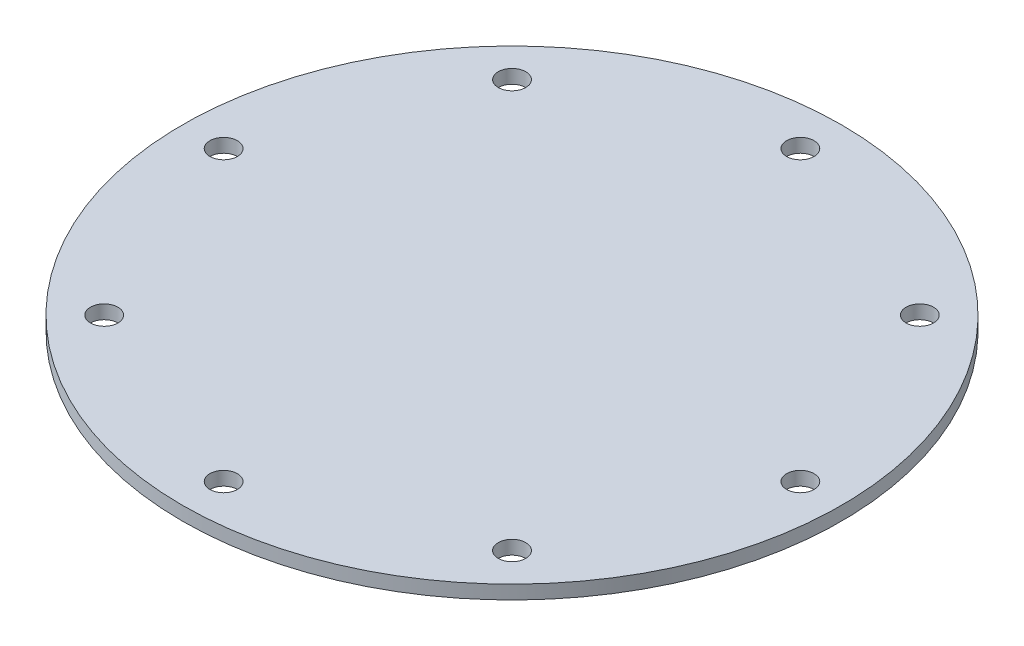
ISO-10303-21;
HEADER;
FILE_DESCRIPTION(('STEP AP214'),'2;1');
FILE_NAME('part.step','',(''),(''),'','','');
FILE_SCHEMA(('AUTOMOTIVE_DESIGN { 1 0 10303 214 1 1 1 1 }'));
ENDSEC;
DATA;
#1=APPLICATION_CONTEXT('core data for automotive mechanical design processes');
#2=APPLICATION_PROTOCOL_DEFINITION('international standard','automotive_design',2000,#1);
#3=PRODUCT_CONTEXT('',#1,'mechanical');
#4=PRODUCT('Part','Part','',(#3));
#5=PRODUCT_RELATED_PRODUCT_CATEGORY('part','',(#4));
#6=PRODUCT_DEFINITION_FORMATION('','',#4);
#7=PRODUCT_DEFINITION_CONTEXT('part definition',#1,'design');
#8=PRODUCT_DEFINITION('design','',#6,#7);
#9=PRODUCT_DEFINITION_SHAPE('','',#8);
#10=(LENGTH_UNIT() NAMED_UNIT(*) SI_UNIT(.MILLI.,.METRE.));
#11=(NAMED_UNIT(*) PLANE_ANGLE_UNIT() SI_UNIT($,.RADIAN.));
#12=(NAMED_UNIT(*) SI_UNIT($,.STERADIAN.) SOLID_ANGLE_UNIT());
#13=UNCERTAINTY_MEASURE_WITH_UNIT(LENGTH_MEASURE(1.E-05),#10,'distance_accuracy_value','');
#14=(GEOMETRIC_REPRESENTATION_CONTEXT(3) GLOBAL_UNCERTAINTY_ASSIGNED_CONTEXT((#13)) GLOBAL_UNIT_ASSIGNED_CONTEXT((#10,
#11,#12)) REPRESENTATION_CONTEXT('',''));
#15=CARTESIAN_POINT('',(0.,0.,0.));
#16=DIRECTION('',(0.,0.,1.));
#17=DIRECTION('',(1.,0.,0.));
#18=AXIS2_PLACEMENT_3D('',#15,#16,#17);
#19=CARTESIAN_POINT('',(0.,5.,0.));
#20=DIRECTION('',(0.,-1.,0.));
#21=DIRECTION('',(0.,0.,-1.));
#22=AXIS2_PLACEMENT_3D('',#19,#20,#21);
#23=CYLINDRICAL_SURFACE('',#22,120.);
#24=CARTESIAN_POINT('',(0.,5.,0.));
#25=DIRECTION('',(0.,1.,0.));
#26=DIRECTION('',(0.,0.,1.));
#27=AXIS2_PLACEMENT_3D('',#24,#25,#26);
#28=CIRCLE('',#27,120.);
#29=CARTESIAN_POINT('',(0.,5.,120.));
#30=VERTEX_POINT('',#29);
#31=EDGE_CURVE('E10',#30,#30,#28,.T.);
#32=ORIENTED_EDGE('',*,*,#31,.F.);
#33=EDGE_LOOP('',(#32));
#34=FACE_BOUND('',#33,.T.);
#35=CARTESIAN_POINT('',(0.,0.,0.));
#36=DIRECTION('',(0.,1.,0.));
#37=DIRECTION('',(0.,0.,1.));
#38=AXIS2_PLACEMENT_3D('',#35,#36,#37);
#39=CIRCLE('',#38,120.);
#40=CARTESIAN_POINT('',(0.,0.,120.));
#41=VERTEX_POINT('',#40);
#42=EDGE_CURVE('E36',#41,#41,#39,.T.);
#43=ORIENTED_EDGE('',*,*,#42,.T.);
#44=EDGE_LOOP('',(#43));
#45=FACE_BOUND('',#44,.T.);
#46=ADVANCED_FACE('F33',(#34,#45),#23,.T.);
#47=CARTESIAN_POINT('',(0.,5.,0.));
#48=DIRECTION('',(0.,1.,0.));
#49=DIRECTION('',(0.,0.,1.));
#50=AXIS2_PLACEMENT_3D('',#47,#48,#49);
#51=PLANE('',#50);
#52=CARTESIAN_POINT('',(-3.66605540578529E-13,5.,105.));
#53=DIRECTION('',(0.,1.,0.));
#54=DIRECTION('',(-1.,0.,0.));
#55=AXIS2_PLACEMENT_3D('',#52,#53,#54);
#56=CIRCLE('',#55,4.99999999999999);
#57=CARTESIAN_POINT('',(-5.00000000000036,5.,105.));
#58=VERTEX_POINT('',#57);
#59=EDGE_CURVE('E74',#58,#58,#56,.T.);
#60=ORIENTED_EDGE('',*,*,#59,.F.);
#61=EDGE_LOOP('',(#60));
#62=FACE_BOUND('',#61,.T.);
#63=CARTESIAN_POINT('',(-74.2462120245879,5.,74.2462120245871));
#64=DIRECTION('',(0.,1.,0.));
#65=DIRECTION('',(-0.707106781186544,0.,-0.707106781186551));
#66=AXIS2_PLACEMENT_3D('',#63,#64,#65);
#67=CIRCLE('',#66,4.99999999999999);
#68=CARTESIAN_POINT('',(-77.7817459305206,5.,70.7106781186543));
#69=VERTEX_POINT('',#68);
#70=EDGE_CURVE('E68',#69,#69,#67,.T.);
#71=ORIENTED_EDGE('',*,*,#70,.F.);
#72=EDGE_LOOP('',(#71));
#73=FACE_BOUND('',#72,.T.);
#74=CARTESIAN_POINT('',(-105.,5.,0.));
#75=DIRECTION('',(0.,1.,0.));
#76=DIRECTION('',(0.,0.,-1.));
#77=AXIS2_PLACEMENT_3D('',#74,#75,#76);
#78=CIRCLE('',#77,4.99999999999999);
#79=CARTESIAN_POINT('',(-105.,5.,-4.99999999999999));
#80=VERTEX_POINT('',#79);
#81=EDGE_CURVE('E60',#80,#80,#78,.T.);
#82=ORIENTED_EDGE('',*,*,#81,.F.);
#83=EDGE_LOOP('',(#82));
#84=FACE_BOUND('',#83,.T.);
#85=CARTESIAN_POINT('',(-74.2462120245868,5.,-74.2462120245881));
#86=DIRECTION('',(0.,1.,0.));
#87=DIRECTION('',(0.707106781186554,0.,-0.707106781186541));
#88=AXIS2_PLACEMENT_3D('',#85,#86,#87);
#89=CIRCLE('',#88,4.99999999999999);
#90=CARTESIAN_POINT('',(-70.7106781186541,5.,-77.7817459305208));
#91=VERTEX_POINT('',#90);
#92=EDGE_CURVE('E61',#91,#91,#89,.T.);
#93=ORIENTED_EDGE('',*,*,#92,.F.);
#94=EDGE_LOOP('',(#93));
#95=FACE_BOUND('',#94,.T.);
#96=CARTESIAN_POINT('',(1.09981662173559E-12,5.,-105.));
#97=DIRECTION('',(0.,1.,0.));
#98=DIRECTION('',(1.,0.,0.));
#99=AXIS2_PLACEMENT_3D('',#96,#97,#98);
#100=CIRCLE('',#99,4.99999999999999);
#101=CARTESIAN_POINT('',(5.00000000000109,5.,-105.));
#102=VERTEX_POINT('',#101);
#103=EDGE_CURVE('E84',#102,#102,#100,.T.);
#104=ORIENTED_EDGE('',*,*,#103,.F.);
#105=EDGE_LOOP('',(#104));
#106=FACE_BOUND('',#105,.T.);
#107=CARTESIAN_POINT('',(74.2462120245884,5.,-74.2462120245866));
#108=DIRECTION('',(0.,1.,0.));
#109=DIRECTION('',(0.707106781186539,0.,0.707106781186556));
#110=AXIS2_PLACEMENT_3D('',#107,#108,#109);
#111=CIRCLE('',#110,4.99999999999999);
#112=CARTESIAN_POINT('',(77.7817459305211,5.,-70.7106781186538));
#113=VERTEX_POINT('',#112);
#114=EDGE_CURVE('E85',#113,#113,#111,.T.);
#115=ORIENTED_EDGE('',*,*,#114,.F.);
#116=EDGE_LOOP('',(#115));
#117=FACE_BOUND('',#116,.T.);
#118=CARTESIAN_POINT('',(74.2462120245874,5.,74.2462120245876));
#119=DIRECTION('',(0.,1.,0.));
#120=DIRECTION('',(-0.707106781186549,0.,0.707106781186546));
#121=AXIS2_PLACEMENT_3D('',#118,#119,#120);
#122=CIRCLE('',#121,4.99999999999999);
#123=CARTESIAN_POINT('',(70.7106781186546,5.,77.7817459305203));
#124=VERTEX_POINT('',#123);
#125=EDGE_CURVE('E53',#124,#124,#122,.T.);
#126=ORIENTED_EDGE('',*,*,#125,.F.);
#127=EDGE_LOOP('',(#126));
#128=FACE_BOUND('',#127,.T.);
#129=CARTESIAN_POINT('',(105.,5.,0.));
#130=DIRECTION('',(0.,1.,0.));
#131=DIRECTION('',(0.,0.,1.));
#132=AXIS2_PLACEMENT_3D('',#129,#130,#131);
#133=CIRCLE('',#132,4.99999999999999);
#134=CARTESIAN_POINT('',(105.,5.,4.99999999999999));
#135=VERTEX_POINT('',#134);
#136=EDGE_CURVE('E47',#135,#135,#133,.T.);
#137=ORIENTED_EDGE('',*,*,#136,.F.);
#138=EDGE_LOOP('',(#137));
#139=FACE_BOUND('',#138,.T.);
#140=ORIENTED_EDGE('',*,*,#31,.T.);
#141=EDGE_LOOP('',(#140));
#142=FACE_BOUND('',#141,.T.);
#143=ADVANCED_FACE('F96',(#62,#73,#84,#95,#106,#117,#128,#139,#142),#51,.T.);
#144=CARTESIAN_POINT('',(0.,0.,0.));
#145=DIRECTION('',(0.,1.,0.));
#146=DIRECTION('',(0.,0.,1.));
#147=AXIS2_PLACEMENT_3D('',#144,#145,#146);
#148=PLANE('',#147);
#149=CARTESIAN_POINT('',(-3.66605540578529E-13,0.,105.));
#150=DIRECTION('',(0.,1.,0.));
#151=DIRECTION('',(-1.,0.,0.));
#152=AXIS2_PLACEMENT_3D('',#149,#150,#151);
#153=CIRCLE('',#152,4.99999999999999);
#154=CARTESIAN_POINT('',(-5.00000000000036,0.,105.));
#155=VERTEX_POINT('',#154);
#156=EDGE_CURVE('E56',#155,#155,#153,.T.);
#157=ORIENTED_EDGE('',*,*,#156,.T.);
#158=EDGE_LOOP('',(#157));
#159=FACE_BOUND('',#158,.T.);
#160=CARTESIAN_POINT('',(-74.2462120245879,0.,74.2462120245871));
#161=DIRECTION('',(0.,1.,0.));
#162=DIRECTION('',(-0.707106781186544,0.,-0.707106781186551));
#163=AXIS2_PLACEMENT_3D('',#160,#161,#162);
#164=CIRCLE('',#163,4.99999999999999);
#165=CARTESIAN_POINT('',(-77.7817459305206,0.,70.7106781186543));
#166=VERTEX_POINT('',#165);
#167=EDGE_CURVE('E71',#166,#166,#164,.T.);
#168=ORIENTED_EDGE('',*,*,#167,.T.);
#169=EDGE_LOOP('',(#168));
#170=FACE_BOUND('',#169,.T.);
#171=CARTESIAN_POINT('',(-105.,0.,0.));
#172=DIRECTION('',(0.,1.,0.));
#173=DIRECTION('',(0.,0.,-1.));
#174=AXIS2_PLACEMENT_3D('',#171,#172,#173);
#175=CIRCLE('',#174,4.99999999999999);
#176=CARTESIAN_POINT('',(-105.,0.,-4.99999999999999));
#177=VERTEX_POINT('',#176);
#178=EDGE_CURVE('E65',#177,#177,#175,.T.);
#179=ORIENTED_EDGE('',*,*,#178,.T.);
#180=EDGE_LOOP('',(#179));
#181=FACE_BOUND('',#180,.T.);
#182=CARTESIAN_POINT('',(-74.2462120245868,0.,-74.2462120245881));
#183=DIRECTION('',(0.,1.,0.));
#184=DIRECTION('',(0.707106781186554,0.,-0.707106781186541));
#185=AXIS2_PLACEMENT_3D('',#182,#183,#184);
#186=CIRCLE('',#185,4.99999999999999);
#187=CARTESIAN_POINT('',(-70.7106781186541,0.,-77.7817459305208));
#188=VERTEX_POINT('',#187);
#189=EDGE_CURVE('E57',#188,#188,#186,.T.);
#190=ORIENTED_EDGE('',*,*,#189,.T.);
#191=EDGE_LOOP('',(#190));
#192=FACE_BOUND('',#191,.T.);
#193=CARTESIAN_POINT('',(1.09981662173559E-12,0.,-105.));
#194=DIRECTION('',(0.,1.,0.));
#195=DIRECTION('',(1.,0.,0.));
#196=AXIS2_PLACEMENT_3D('',#193,#194,#195);
#197=CIRCLE('',#196,4.99999999999999);
#198=CARTESIAN_POINT('',(5.00000000000109,0.,-105.));
#199=VERTEX_POINT('',#198);
#200=EDGE_CURVE('E64',#199,#199,#197,.T.);
#201=ORIENTED_EDGE('',*,*,#200,.T.);
#202=EDGE_LOOP('',(#201));
#203=FACE_BOUND('',#202,.T.);
#204=CARTESIAN_POINT('',(74.2462120245884,0.,-74.2462120245866));
#205=DIRECTION('',(0.,1.,0.));
#206=DIRECTION('',(0.707106781186539,0.,0.707106781186556));
#207=AXIS2_PLACEMENT_3D('',#204,#205,#206);
#208=CIRCLE('',#207,4.99999999999999);
#209=CARTESIAN_POINT('',(77.7817459305211,0.,-70.7106781186538));
#210=VERTEX_POINT('',#209);
#211=EDGE_CURVE('E81',#210,#210,#208,.T.);
#212=ORIENTED_EDGE('',*,*,#211,.T.);
#213=EDGE_LOOP('',(#212));
#214=FACE_BOUND('',#213,.T.);
#215=CARTESIAN_POINT('',(74.2462120245874,0.,74.2462120245876));
#216=DIRECTION('',(0.,1.,0.));
#217=DIRECTION('',(-0.707106781186549,0.,0.707106781186546));
#218=AXIS2_PLACEMENT_3D('',#215,#216,#217);
#219=CIRCLE('',#218,4.99999999999999);
#220=CARTESIAN_POINT('',(70.7106781186546,0.,77.7817459305203));
#221=VERTEX_POINT('',#220);
#222=EDGE_CURVE('E50',#221,#221,#219,.T.);
#223=ORIENTED_EDGE('',*,*,#222,.T.);
#224=EDGE_LOOP('',(#223));
#225=FACE_BOUND('',#224,.T.);
#226=CARTESIAN_POINT('',(105.,0.,0.));
#227=DIRECTION('',(0.,1.,0.));
#228=DIRECTION('',(0.,0.,1.));
#229=AXIS2_PLACEMENT_3D('',#226,#227,#228);
#230=CIRCLE('',#229,4.99999999999999);
#231=CARTESIAN_POINT('',(105.,0.,4.99999999999999));
#232=VERTEX_POINT('',#231);
#233=EDGE_CURVE('E43',#232,#232,#230,.T.);
#234=ORIENTED_EDGE('',*,*,#233,.T.);
#235=EDGE_LOOP('',(#234));
#236=FACE_BOUND('',#235,.T.);
#237=ORIENTED_EDGE('',*,*,#42,.F.);
#238=EDGE_LOOP('',(#237));
#239=FACE_BOUND('',#238,.T.);
#240=ADVANCED_FACE('F99',(#159,#170,#181,#192,#203,#214,#225,#236,#239),#148,.F.);
#241=CARTESIAN_POINT('',(105.,5.,0.));
#242=DIRECTION('',(0.,1.,0.));
#243=DIRECTION('',(0.,0.,1.));
#244=AXIS2_PLACEMENT_3D('',#241,#242,#243);
#245=CYLINDRICAL_SURFACE('',#244,4.99999999999999);
#246=ORIENTED_EDGE('',*,*,#136,.T.);
#247=EDGE_LOOP('',(#246));
#248=FACE_BOUND('',#247,.T.);
#249=ORIENTED_EDGE('',*,*,#233,.F.);
#250=EDGE_LOOP('',(#249));
#251=FACE_BOUND('',#250,.T.);
#252=ADVANCED_FACE('F108',(#248,#251),#245,.F.);
#253=CARTESIAN_POINT('',(74.2462120245874,5.,74.2462120245876));
#254=DIRECTION('',(0.,1.,0.));
#255=DIRECTION('',(-0.707106781186549,0.,0.707106781186546));
#256=AXIS2_PLACEMENT_3D('',#253,#254,#255);
#257=CYLINDRICAL_SURFACE('',#256,4.99999999999999);
#258=ORIENTED_EDGE('',*,*,#125,.T.);
#259=EDGE_LOOP('',(#258));
#260=FACE_BOUND('',#259,.T.);
#261=ORIENTED_EDGE('',*,*,#222,.F.);
#262=EDGE_LOOP('',(#261));
#263=FACE_BOUND('',#262,.T.);
#264=ADVANCED_FACE('F111',(#260,#263),#257,.F.);
#265=CARTESIAN_POINT('',(74.2462120245884,5.,-74.2462120245866));
#266=DIRECTION('',(0.,1.,0.));
#267=DIRECTION('',(0.707106781186539,0.,0.707106781186556));
#268=AXIS2_PLACEMENT_3D('',#265,#266,#267);
#269=CYLINDRICAL_SURFACE('',#268,4.99999999999999);
#270=ORIENTED_EDGE('',*,*,#114,.T.);
#271=EDGE_LOOP('',(#270));
#272=FACE_BOUND('',#271,.T.);
#273=ORIENTED_EDGE('',*,*,#211,.F.);
#274=EDGE_LOOP('',(#273));
#275=FACE_BOUND('',#274,.T.);
#276=ADVANCED_FACE('F142',(#272,#275),#269,.F.);
#277=CARTESIAN_POINT('',(1.09981662173559E-12,5.,-105.));
#278=DIRECTION('',(0.,1.,0.));
#279=DIRECTION('',(1.,0.,0.));
#280=AXIS2_PLACEMENT_3D('',#277,#278,#279);
#281=CYLINDRICAL_SURFACE('',#280,4.99999999999999);
#282=ORIENTED_EDGE('',*,*,#103,.T.);
#283=EDGE_LOOP('',(#282));
#284=FACE_BOUND('',#283,.T.);
#285=ORIENTED_EDGE('',*,*,#200,.F.);
#286=EDGE_LOOP('',(#285));
#287=FACE_BOUND('',#286,.T.);
#288=ADVANCED_FACE('F93',(#284,#287),#281,.F.);
#289=CARTESIAN_POINT('',(-74.2462120245868,5.,-74.2462120245881));
#290=DIRECTION('',(0.,1.,0.));
#291=DIRECTION('',(0.707106781186554,0.,-0.707106781186541));
#292=AXIS2_PLACEMENT_3D('',#289,#290,#291);
#293=CYLINDRICAL_SURFACE('',#292,4.99999999999999);
#294=ORIENTED_EDGE('',*,*,#92,.T.);
#295=EDGE_LOOP('',(#294));
#296=FACE_BOUND('',#295,.T.);
#297=ORIENTED_EDGE('',*,*,#189,.F.);
#298=EDGE_LOOP('',(#297));
#299=FACE_BOUND('',#298,.T.);
#300=ADVANCED_FACE('F157',(#296,#299),#293,.F.);
#301=CARTESIAN_POINT('',(-105.,5.,0.));
#302=DIRECTION('',(0.,1.,0.));
#303=DIRECTION('',(0.,0.,-1.));
#304=AXIS2_PLACEMENT_3D('',#301,#302,#303);
#305=CYLINDRICAL_SURFACE('',#304,4.99999999999999);
#306=ORIENTED_EDGE('',*,*,#81,.T.);
#307=EDGE_LOOP('',(#306));
#308=FACE_BOUND('',#307,.T.);
#309=ORIENTED_EDGE('',*,*,#178,.F.);
#310=EDGE_LOOP('',(#309));
#311=FACE_BOUND('',#310,.T.);
#312=ADVANCED_FACE('F164',(#308,#311),#305,.F.);
#313=CARTESIAN_POINT('',(-74.2462120245879,5.,74.2462120245871));
#314=DIRECTION('',(0.,1.,0.));
#315=DIRECTION('',(-0.707106781186544,0.,-0.707106781186551));
#316=AXIS2_PLACEMENT_3D('',#313,#314,#315);
#317=CYLINDRICAL_SURFACE('',#316,4.99999999999999);
#318=ORIENTED_EDGE('',*,*,#70,.T.);
#319=EDGE_LOOP('',(#318));
#320=FACE_BOUND('',#319,.T.);
#321=ORIENTED_EDGE('',*,*,#167,.F.);
#322=EDGE_LOOP('',(#321));
#323=FACE_BOUND('',#322,.T.);
#324=ADVANCED_FACE('F172',(#320,#323),#317,.F.);
#325=CARTESIAN_POINT('',(-3.66605540578529E-13,5.,105.));
#326=DIRECTION('',(0.,1.,0.));
#327=DIRECTION('',(-1.,0.,0.));
#328=AXIS2_PLACEMENT_3D('',#325,#326,#327);
#329=CYLINDRICAL_SURFACE('',#328,4.99999999999999);
#330=ORIENTED_EDGE('',*,*,#59,.T.);
#331=EDGE_LOOP('',(#330));
#332=FACE_BOUND('',#331,.T.);
#333=ORIENTED_EDGE('',*,*,#156,.F.);
#334=EDGE_LOOP('',(#333));
#335=FACE_BOUND('',#334,.T.);
#336=ADVANCED_FACE('F180',(#332,#335),#329,.F.);
#337=CLOSED_SHELL('',(#46,#143,#240,#252,#264,#276,#288,#300,#312,#324,#336));
#338=MANIFOLD_SOLID_BREP('B2',#337);
#339=ADVANCED_BREP_SHAPE_REPRESENTATION('',(#18,#338),#14);
#340=SHAPE_DEFINITION_REPRESENTATION(#9,#339);
ENDSEC;
END-ISO-10303-21;
